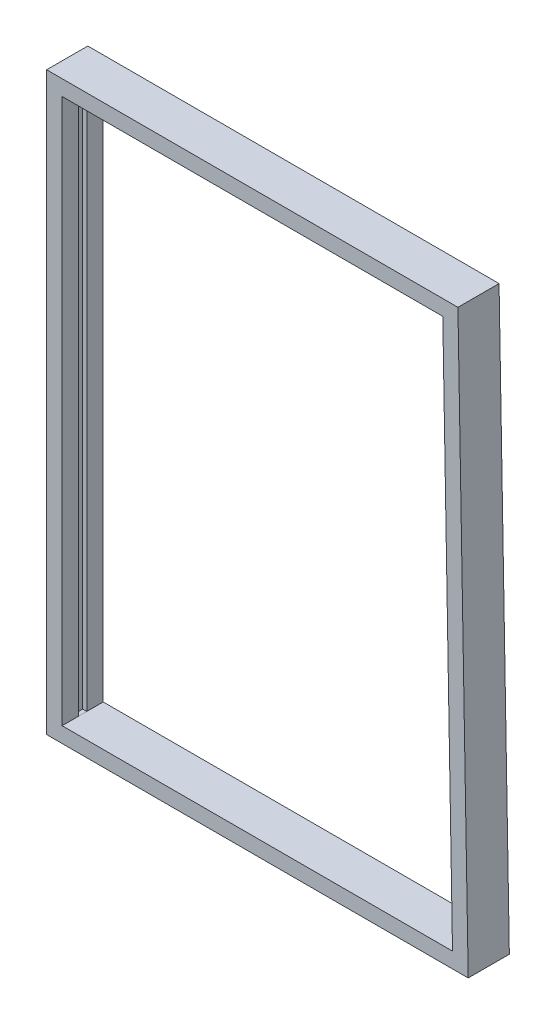
ISO-10303-21;
HEADER;
FILE_DESCRIPTION(('STEP AP214'),'2;1');
FILE_NAME('part.step','',(''),(''),'','','');
FILE_SCHEMA(('AUTOMOTIVE_DESIGN { 1 0 10303 214 1 1 1 1 }'));
ENDSEC;
DATA;
#1=APPLICATION_CONTEXT('core data for automotive mechanical design processes');
#2=APPLICATION_PROTOCOL_DEFINITION('international standard','automotive_design',2000,#1);
#3=PRODUCT_CONTEXT('',#1,'mechanical');
#4=PRODUCT('Part','Part','',(#3));
#5=PRODUCT_RELATED_PRODUCT_CATEGORY('part','',(#4));
#6=PRODUCT_DEFINITION_FORMATION('','',#4);
#7=PRODUCT_DEFINITION_CONTEXT('part definition',#1,'design');
#8=PRODUCT_DEFINITION('design','',#6,#7);
#9=PRODUCT_DEFINITION_SHAPE('','',#8);
#10=(LENGTH_UNIT() NAMED_UNIT(*) SI_UNIT(.MILLI.,.METRE.));
#11=(NAMED_UNIT(*) PLANE_ANGLE_UNIT() SI_UNIT($,.RADIAN.));
#12=(NAMED_UNIT(*) SI_UNIT($,.STERADIAN.) SOLID_ANGLE_UNIT());
#13=UNCERTAINTY_MEASURE_WITH_UNIT(LENGTH_MEASURE(1.E-05),#10,'distance_accuracy_value','');
#14=(GEOMETRIC_REPRESENTATION_CONTEXT(3) GLOBAL_UNCERTAINTY_ASSIGNED_CONTEXT((#13)) GLOBAL_UNIT_ASSIGNED_CONTEXT((#10,
#11,#12)) REPRESENTATION_CONTEXT('',''));
#15=CARTESIAN_POINT('',(0.,0.,0.));
#16=DIRECTION('',(0.,0.,1.));
#17=DIRECTION('',(1.,0.,0.));
#18=AXIS2_PLACEMENT_3D('',#15,#16,#17);
#19=CARTESIAN_POINT('',(-482.6,673.091493891155,101.6));
#20=DIRECTION('',(1.,0.,0.));
#21=DIRECTION('',(0.,0.,-1.));
#22=AXIS2_PLACEMENT_3D('',#19,#20,#21);
#23=PLANE('',#22);
#24=DIRECTION('',(0.,1.,0.));
#25=VECTOR('',#24,1.);
#26=CARTESIAN_POINT('',(-482.6,673.095746945578,40.64));
#27=LINE('',#26,#25);
#28=CARTESIAN_POINT('',(-482.6,-673.1,40.6399999999999));
#29=VERTEX_POINT('',#28);
#30=CARTESIAN_POINT('',(-482.6,673.091493891155,40.6399999999999));
#31=VERTEX_POINT('',#30);
#32=EDGE_CURVE('E53',#29,#31,#27,.T.);
#33=ORIENTED_EDGE('',*,*,#32,.F.);
#34=DIRECTION('',(0.,0.,-1.));
#35=VECTOR('',#34,1.);
#36=CARTESIAN_POINT('',(-482.6,-673.1,101.6));
#37=LINE('',#36,#35);
#38=CARTESIAN_POINT('',(-482.6,-673.1,0.));
#39=VERTEX_POINT('',#38);
#40=EDGE_CURVE('E296',#29,#39,#37,.T.);
#41=ORIENTED_EDGE('',*,*,#40,.T.);
#42=DIRECTION('',(0.,-1.,0.));
#43=VECTOR('',#42,1.);
#44=CARTESIAN_POINT('',(-482.6,673.091493891155,0.));
#45=LINE('',#44,#43);
#46=CARTESIAN_POINT('',(-482.6,673.091493891155,0.));
#47=VERTEX_POINT('',#46);
#48=EDGE_CURVE('E261',#47,#39,#45,.T.);
#49=ORIENTED_EDGE('',*,*,#48,.F.);
#50=DIRECTION('',(0.,0.,-1.));
#51=VECTOR('',#50,1.);
#52=CARTESIAN_POINT('',(-482.6,673.091493891155,101.6));
#53=LINE('',#52,#51);
#54=EDGE_CURVE('E272',#31,#47,#53,.T.);
#55=ORIENTED_EDGE('',*,*,#54,.F.);
#56=EDGE_LOOP('',(#33,#41,#49,#55));
#57=FACE_BOUND('',#56,.T.);
#58=ADVANCED_FACE('F38',(#57),#23,.T.);
#59=CARTESIAN_POINT('',(457.874215727726,672.881549449167,101.6));
#60=DIRECTION('',(-0.999840548194239,-0.0178571606545579,0.));
#61=DIRECTION('',(0.0178571606545579,-0.99984054819424,0.));
#62=AXIS2_PLACEMENT_3D('',#59,#60,#61);
#63=PLANE('',#62);
#64=DIRECTION('',(-0.0178571606545579,0.99984054819424,0.));
#65=VECTOR('',#64,1.);
#66=CARTESIAN_POINT('',(457.874181824698,672.883447714127,60.96));
#67=LINE('',#66,#65);
#68=CARTESIAN_POINT('',(481.913457594836,-673.1,60.9600000000001));
#69=VERTEX_POINT('',#68);
#70=CARTESIAN_POINT('',(457.874215727726,672.881549449167,60.9600000000001));
#71=VERTEX_POINT('',#70);
#72=EDGE_CURVE('E61',#69,#71,#67,.T.);
#73=ORIENTED_EDGE('',*,*,#72,.F.);
#74=DIRECTION('',(0.,0.,-1.));
#75=VECTOR('',#74,1.);
#76=CARTESIAN_POINT('',(481.913457594836,-673.1,101.6));
#77=LINE('',#76,#75);
#78=CARTESIAN_POINT('',(481.913457594836,-673.1,101.6));
#79=VERTEX_POINT('',#78);
#80=EDGE_CURVE('E293',#79,#69,#77,.T.);
#81=ORIENTED_EDGE('',*,*,#80,.F.);
#82=DIRECTION('',(-0.0178571606545579,0.999840548194239,0.));
#83=VECTOR('',#82,1.);
#84=CARTESIAN_POINT('',(457.874215727726,672.881549449167,101.6));
#85=LINE('',#84,#83);
#86=CARTESIAN_POINT('',(457.874215727726,672.881549449167,101.6));
#87=VERTEX_POINT('',#86);
#88=EDGE_CURVE('E267',#79,#87,#85,.T.);
#89=ORIENTED_EDGE('',*,*,#88,.T.);
#90=DIRECTION('',(0.,0.,-1.));
#91=VECTOR('',#90,1.);
#92=CARTESIAN_POINT('',(457.874215727726,672.881549449167,101.6));
#93=LINE('',#92,#91);
#94=EDGE_CURVE('E288',#87,#71,#93,.T.);
#95=ORIENTED_EDGE('',*,*,#94,.T.);
#96=EDGE_LOOP('',(#73,#81,#89,#95));
#97=FACE_BOUND('',#96,.T.);
#98=ADVANCED_FACE('F354',(#97),#63,.T.);
#99=CARTESIAN_POINT('',(0.,0.,101.6));
#100=DIRECTION('',(0.,0.,1.));
#101=DIRECTION('',(1.,0.,0.));
#102=AXIS2_PLACEMENT_3D('',#99,#100,#101);
#103=PLANE('',#102);
#104=DIRECTION('',(0.,-1.,0.));
#105=VECTOR('',#104,1.);
#106=CARTESIAN_POINT('',(-520.7,711.2,101.6));
#107=LINE('',#106,#105);
#108=CARTESIAN_POINT('',(-520.7,711.2,101.6));
#109=VERTEX_POINT('',#108);
#110=CARTESIAN_POINT('',(-520.7,-711.2,101.6));
#111=VERTEX_POINT('',#110);
#112=EDGE_CURVE('E301',#109,#111,#107,.T.);
#113=ORIENTED_EDGE('',*,*,#112,.T.);
#114=DIRECTION('',(1.,0.,0.));
#115=VECTOR('',#114,1.);
#116=CARTESIAN_POINT('',(-520.7,-711.2,101.6));
#117=LINE('',#116,#115);
#118=CARTESIAN_POINT('',(520.7,-711.2,101.6));
#119=VERTEX_POINT('',#118);
#120=EDGE_CURVE('E304',#111,#119,#117,.T.);
#121=ORIENTED_EDGE('',*,*,#120,.T.);
#122=DIRECTION('',(-0.0178571606545579,0.999840548194239,0.));
#123=VECTOR('',#122,1.);
#124=CARTESIAN_POINT('',(495.299974684957,710.973195751486,101.6));
#125=LINE('',#124,#123);
#126=CARTESIAN_POINT('',(495.299974684957,710.973195751486,101.6));
#127=VERTEX_POINT('',#126);
#128=EDGE_CURVE('E307',#119,#127,#125,.T.);
#129=ORIENTED_EDGE('',*,*,#128,.T.);
#130=DIRECTION('',(-0.999999975083619,0.000223232528064809,0.));
#131=VECTOR('',#130,1.);
#132=CARTESIAN_POINT('',(-520.7,711.2,101.6));
#133=LINE('',#132,#131);
#134=EDGE_CURVE('E309',#127,#109,#133,.T.);
#135=ORIENTED_EDGE('',*,*,#134,.T.);
#136=EDGE_LOOP('',(#113,#121,#129,#135));
#137=FACE_BOUND('',#136,.T.);
#138=DIRECTION('',(1.,0.,0.));
#139=VECTOR('',#138,1.);
#140=CARTESIAN_POINT('',(-482.6,-673.1,101.6));
#141=LINE('',#140,#139);
#142=CARTESIAN_POINT('',(-482.6,-673.1,101.6));
#143=VERTEX_POINT('',#142);
#144=EDGE_CURVE('E264',#143,#79,#141,.T.);
#145=ORIENTED_EDGE('',*,*,#144,.F.);
#146=DIRECTION('',(0.,-1.,0.));
#147=VECTOR('',#146,1.);
#148=CARTESIAN_POINT('',(-482.6,673.091493891155,101.6));
#149=LINE('',#148,#147);
#150=CARTESIAN_POINT('',(-482.6,673.091493891155,101.6));
#151=VERTEX_POINT('',#150);
#152=EDGE_CURVE('E262',#151,#143,#149,.T.);
#153=ORIENTED_EDGE('',*,*,#152,.F.);
#154=DIRECTION('',(-0.999999975083619,0.000223232528064827,0.));
#155=VECTOR('',#154,1.);
#156=CARTESIAN_POINT('',(-482.6,673.091493891155,101.6));
#157=LINE('',#156,#155);
#158=EDGE_CURVE('E270',#87,#151,#157,.T.);
#159=ORIENTED_EDGE('',*,*,#158,.F.);
#160=ORIENTED_EDGE('',*,*,#88,.F.);
#161=EDGE_LOOP('',(#145,#153,#159,#160));
#162=FACE_BOUND('',#161,.T.);
#163=ADVANCED_FACE('F344',(#137,#162),#103,.T.);
#164=CARTESIAN_POINT('',(0.,0.,0.));
#165=DIRECTION('',(0.,0.,1.));
#166=DIRECTION('',(1.,0.,0.));
#167=AXIS2_PLACEMENT_3D('',#164,#165,#166);
#168=PLANE('',#167);
#169=DIRECTION('',(0.,-1.,0.));
#170=VECTOR('',#169,1.);
#171=CARTESIAN_POINT('',(-520.7,711.2,0.));
#172=LINE('',#171,#170);
#173=CARTESIAN_POINT('',(-520.7,711.2,0.));
#174=VERTEX_POINT('',#173);
#175=CARTESIAN_POINT('',(-520.7,-711.2,0.));
#176=VERTEX_POINT('',#175);
#177=EDGE_CURVE('E300',#174,#176,#172,.T.);
#178=ORIENTED_EDGE('',*,*,#177,.F.);
#179=DIRECTION('',(-0.999999975083619,0.000223232528064809,0.));
#180=VECTOR('',#179,1.);
#181=CARTESIAN_POINT('',(-520.7,711.2,0.));
#182=LINE('',#181,#180);
#183=CARTESIAN_POINT('',(495.299974684957,710.973195751486,0.));
#184=VERTEX_POINT('',#183);
#185=EDGE_CURVE('E305',#184,#174,#182,.T.);
#186=ORIENTED_EDGE('',*,*,#185,.F.);
#187=DIRECTION('',(-0.0178571606545579,0.999840548194239,0.));
#188=VECTOR('',#187,1.);
#189=CARTESIAN_POINT('',(495.299974684957,710.973195751486,0.));
#190=LINE('',#189,#188);
#191=CARTESIAN_POINT('',(520.7,-711.2,0.));
#192=VERTEX_POINT('',#191);
#193=EDGE_CURVE('E316',#192,#184,#190,.T.);
#194=ORIENTED_EDGE('',*,*,#193,.F.);
#195=DIRECTION('',(1.,0.,0.));
#196=VECTOR('',#195,1.);
#197=CARTESIAN_POINT('',(-520.7,-711.2,0.));
#198=LINE('',#197,#196);
#199=EDGE_CURVE('E314',#176,#192,#198,.T.);
#200=ORIENTED_EDGE('',*,*,#199,.F.);
#201=EDGE_LOOP('',(#178,#186,#194,#200));
#202=FACE_BOUND('',#201,.T.);
#203=ORIENTED_EDGE('',*,*,#48,.T.);
#204=DIRECTION('',(1.,0.,0.));
#205=VECTOR('',#204,1.);
#206=CARTESIAN_POINT('',(-482.6,-673.1,0.));
#207=LINE('',#206,#205);
#208=CARTESIAN_POINT('',(481.913457594836,-673.1,0.));
#209=VERTEX_POINT('',#208);
#210=EDGE_CURVE('E275',#39,#209,#207,.T.);
#211=ORIENTED_EDGE('',*,*,#210,.T.);
#212=DIRECTION('',(-0.0178571606545579,0.999840548194239,0.));
#213=VECTOR('',#212,1.);
#214=CARTESIAN_POINT('',(457.874215727726,672.881549449167,0.));
#215=LINE('',#214,#213);
#216=CARTESIAN_POINT('',(457.874215727726,672.881549449167,0.));
#217=VERTEX_POINT('',#216);
#218=EDGE_CURVE('E278',#209,#217,#215,.T.);
#219=ORIENTED_EDGE('',*,*,#218,.T.);
#220=DIRECTION('',(-0.999999975083619,0.000223232528064827,0.));
#221=VECTOR('',#220,1.);
#222=CARTESIAN_POINT('',(-482.6,673.091493891155,0.));
#223=LINE('',#222,#221);
#224=EDGE_CURVE('E265',#217,#47,#223,.T.);
#225=ORIENTED_EDGE('',*,*,#224,.T.);
#226=EDGE_LOOP('',(#203,#211,#219,#225));
#227=FACE_BOUND('',#226,.T.);
#228=ADVANCED_FACE('F334',(#202,#227),#168,.F.);
#229=CARTESIAN_POINT('',(-520.7,711.2,101.6));
#230=DIRECTION('',(1.,0.,0.));
#231=DIRECTION('',(0.,0.,-1.));
#232=AXIS2_PLACEMENT_3D('',#229,#230,#231);
#233=PLANE('',#232);
#234=ORIENTED_EDGE('',*,*,#177,.T.);
#235=DIRECTION('',(0.,0.,-1.));
#236=VECTOR('',#235,1.);
#237=CARTESIAN_POINT('',(-520.7,-711.2,101.6));
#238=LINE('',#237,#236);
#239=EDGE_CURVE('E11',#111,#176,#238,.T.);
#240=ORIENTED_EDGE('',*,*,#239,.F.);
#241=ORIENTED_EDGE('',*,*,#112,.F.);
#242=DIRECTION('',(0.,0.,-1.));
#243=VECTOR('',#242,1.);
#244=CARTESIAN_POINT('',(-520.7,711.2,101.6));
#245=LINE('',#244,#243);
#246=EDGE_CURVE('E311',#109,#174,#245,.T.);
#247=ORIENTED_EDGE('',*,*,#246,.T.);
#248=EDGE_LOOP('',(#234,#240,#241,#247));
#249=FACE_BOUND('',#248,.T.);
#250=ADVANCED_FACE('F40',(#249),#233,.F.);
#251=CARTESIAN_POINT('',(-520.7,-711.2,101.6));
#252=DIRECTION('',(0.,1.,0.));
#253=DIRECTION('',(0.,0.,1.));
#254=AXIS2_PLACEMENT_3D('',#251,#252,#253);
#255=PLANE('',#254);
#256=ORIENTED_EDGE('',*,*,#199,.T.);
#257=DIRECTION('',(0.,0.,-1.));
#258=VECTOR('',#257,1.);
#259=CARTESIAN_POINT('',(520.7,-711.2,101.6));
#260=LINE('',#259,#258);
#261=EDGE_CURVE('E46',#119,#192,#260,.T.);
#262=ORIENTED_EDGE('',*,*,#261,.F.);
#263=ORIENTED_EDGE('',*,*,#120,.F.);
#264=ORIENTED_EDGE('',*,*,#239,.T.);
#265=EDGE_LOOP('',(#256,#262,#263,#264));
#266=FACE_BOUND('',#265,.T.);
#267=ADVANCED_FACE('F346',(#266),#255,.F.);
#268=CARTESIAN_POINT('',(495.299974684957,710.973195751486,101.6));
#269=DIRECTION('',(-0.999840548194239,-0.0178571606545579,0.));
#270=DIRECTION('',(0.0178571606545579,-0.99984054819424,0.));
#271=AXIS2_PLACEMENT_3D('',#268,#269,#270);
#272=PLANE('',#271);
#273=ORIENTED_EDGE('',*,*,#193,.T.);
#274=DIRECTION('',(0.,0.,-1.));
#275=VECTOR('',#274,1.);
#276=CARTESIAN_POINT('',(495.299974684957,710.973195751486,101.6));
#277=LINE('',#276,#275);
#278=EDGE_CURVE('E321',#127,#184,#277,.T.);
#279=ORIENTED_EDGE('',*,*,#278,.F.);
#280=ORIENTED_EDGE('',*,*,#128,.F.);
#281=ORIENTED_EDGE('',*,*,#261,.T.);
#282=EDGE_LOOP('',(#273,#279,#280,#281));
#283=FACE_BOUND('',#282,.T.);
#284=ADVANCED_FACE('F328',(#283),#272,.F.);
#285=CARTESIAN_POINT('',(-520.7,711.2,101.6));
#286=DIRECTION('',(-0.000223232528064809,-0.999999975083619,0.));
#287=DIRECTION('',(0.999999975083619,-0.000223232528064809,0.));
#288=AXIS2_PLACEMENT_3D('',#285,#286,#287);
#289=PLANE('',#288);
#290=ORIENTED_EDGE('',*,*,#185,.T.);
#291=ORIENTED_EDGE('',*,*,#246,.F.);
#292=ORIENTED_EDGE('',*,*,#134,.F.);
#293=ORIENTED_EDGE('',*,*,#278,.T.);
#294=EDGE_LOOP('',(#290,#291,#292,#293));
#295=FACE_BOUND('',#294,.T.);
#296=ADVANCED_FACE('F338',(#295),#289,.F.);
#297=DIRECTION('',(0.,-1.,0.));
#298=VECTOR('',#297,1.);
#299=CARTESIAN_POINT('',(-482.6,673.095746945578,60.9600000000001));
#300=LINE('',#299,#298);
#301=CARTESIAN_POINT('',(-482.6,673.091493891155,60.9600000000001));
#302=VERTEX_POINT('',#301);
#303=CARTESIAN_POINT('',(-482.6,-673.1,60.9599999999999));
#304=VERTEX_POINT('',#303);
#305=EDGE_CURVE('E213',#302,#304,#300,.T.);
#306=ORIENTED_EDGE('',*,*,#305,.F.);
#307=EDGE_CURVE('E283',#151,#302,#53,.T.);
#308=ORIENTED_EDGE('',*,*,#307,.F.);
#309=ORIENTED_EDGE('',*,*,#152,.T.);
#310=EDGE_CURVE('E297',#143,#304,#37,.T.);
#311=ORIENTED_EDGE('',*,*,#310,.T.);
#312=EDGE_LOOP('',(#306,#308,#309,#311));
#313=FACE_BOUND('',#312,.T.);
#314=ADVANCED_FACE('F357',(#313),#23,.T.);
#315=CARTESIAN_POINT('',(-482.6,-673.1,101.6));
#316=DIRECTION('',(0.,1.,0.));
#317=DIRECTION('',(0.,0.,1.));
#318=AXIS2_PLACEMENT_3D('',#315,#316,#317);
#319=PLANE('',#318);
#320=ORIENTED_EDGE('',*,*,#210,.F.);
#321=ORIENTED_EDGE('',*,*,#40,.F.);
#322=DIRECTION('',(0.,0.,-1.));
#323=VECTOR('',#322,1.);
#324=CARTESIAN_POINT('',(-482.6,-673.1,101.6));
#325=LINE('',#324,#323);
#326=EDGE_CURVE('E217',#304,#29,#325,.T.);
#327=ORIENTED_EDGE('',*,*,#326,.F.);
#328=ORIENTED_EDGE('',*,*,#310,.F.);
#329=ORIENTED_EDGE('',*,*,#144,.T.);
#330=ORIENTED_EDGE('',*,*,#80,.T.);
#331=DIRECTION('',(0.,0.,1.));
#332=VECTOR('',#331,1.);
#333=CARTESIAN_POINT('',(481.913457594836,-673.1,101.6));
#334=LINE('',#333,#332);
#335=CARTESIAN_POINT('',(481.913457594836,-673.1,40.6400000000001));
#336=VERTEX_POINT('',#335);
#337=EDGE_CURVE('E252',#336,#69,#334,.T.);
#338=ORIENTED_EDGE('',*,*,#337,.F.);
#339=EDGE_CURVE('E291',#336,#209,#77,.T.);
#340=ORIENTED_EDGE('',*,*,#339,.T.);
#341=EDGE_LOOP('',(#320,#321,#327,#328,#329,#330,#338,#340));
#342=FACE_BOUND('',#341,.T.);
#343=ADVANCED_FACE('F368',(#342),#319,.T.);
#344=DIRECTION('',(0.0178571606545579,-0.99984054819424,0.));
#345=VECTOR('',#344,1.);
#346=CARTESIAN_POINT('',(457.874181824698,672.883447714127,40.64));
#347=LINE('',#346,#345);
#348=CARTESIAN_POINT('',(457.874215727726,672.881549449167,40.64));
#349=VERTEX_POINT('',#348);
#350=EDGE_CURVE('E247',#349,#336,#347,.T.);
#351=ORIENTED_EDGE('',*,*,#350,.F.);
#352=EDGE_CURVE('E286',#349,#217,#93,.T.);
#353=ORIENTED_EDGE('',*,*,#352,.T.);
#354=ORIENTED_EDGE('',*,*,#218,.F.);
#355=ORIENTED_EDGE('',*,*,#339,.F.);
#356=EDGE_LOOP('',(#351,#353,#354,#355));
#357=FACE_BOUND('',#356,.T.);
#358=ADVANCED_FACE('F365',(#357),#63,.T.);
#359=CARTESIAN_POINT('',(-482.6,673.091493891155,101.6));
#360=DIRECTION('',(-0.000223232528064827,-0.999999975083619,0.));
#361=DIRECTION('',(0.999999975083619,-0.000223232528064827,0.));
#362=AXIS2_PLACEMENT_3D('',#359,#360,#361);
#363=PLANE('',#362);
#364=ORIENTED_EDGE('',*,*,#224,.F.);
#365=ORIENTED_EDGE('',*,*,#352,.F.);
#366=EDGE_CURVE('E292',#71,#349,#93,.T.);
#367=ORIENTED_EDGE('',*,*,#366,.F.);
#368=ORIENTED_EDGE('',*,*,#94,.F.);
#369=ORIENTED_EDGE('',*,*,#158,.T.);
#370=ORIENTED_EDGE('',*,*,#307,.T.);
#371=EDGE_CURVE('E287',#302,#31,#53,.T.);
#372=ORIENTED_EDGE('',*,*,#371,.T.);
#373=ORIENTED_EDGE('',*,*,#54,.T.);
#374=EDGE_LOOP('',(#364,#365,#367,#368,#369,#370,#372,#373));
#375=FACE_BOUND('',#374,.T.);
#376=ADVANCED_FACE('F386',(#375),#363,.T.);
#377=CARTESIAN_POINT('',(469.742047624445,8.38959694701351,0.));
#378=DIRECTION('',(-0.99984054819424,-0.0178571606545579,0.));
#379=DIRECTION('',(0.0178571606545579,-0.99984054819424,0.));
#380=AXIS2_PLACEMENT_3D('',#377,#378,#379);
#381=PLANE('',#380);
#382=ORIENTED_EDGE('',*,*,#337,.T.);
#383=CARTESIAN_POINT('',(481.913491497864,-673.101898264958,60.9600000000001));
#384=VERTEX_POINT('',#383);
#385=EDGE_CURVE('E238',#384,#69,#67,.T.);
#386=ORIENTED_EDGE('',*,*,#385,.F.);
#387=DIRECTION('',(0.,0.,1.));
#388=VECTOR('',#387,1.);
#389=CARTESIAN_POINT('',(481.913491497864,-673.101898264958,40.6400000000001));
#390=LINE('',#389,#388);
#391=CARTESIAN_POINT('',(481.913491497864,-673.101898264958,40.6400000000001));
#392=VERTEX_POINT('',#391);
#393=EDGE_CURVE('E228',#392,#384,#390,.T.);
#394=ORIENTED_EDGE('',*,*,#393,.F.);
#395=EDGE_CURVE('E243',#336,#392,#347,.T.);
#396=ORIENTED_EDGE('',*,*,#395,.F.);
#397=EDGE_LOOP('',(#382,#386,#394,#396));
#398=FACE_BOUND('',#397,.T.);
#399=ADVANCED_FACE('F427',(#398),#381,.F.);
#400=CARTESIAN_POINT('',(468.032561794352,673.064876466378,60.96));
#401=DIRECTION('',(0.,0.,1.));
#402=DIRECTION('',(0.,-1.,0.));
#403=AXIS2_PLACEMENT_3D('',#400,#401,#402);
#404=PLANE('',#403);
#405=ORIENTED_EDGE('',*,*,#385,.T.);
#406=ORIENTED_EDGE('',*,*,#72,.T.);
#407=CARTESIAN_POINT('',(457.874181824698,672.883447714127,60.96));
#408=VERTEX_POINT('',#407);
#409=EDGE_CURVE('E223',#71,#408,#67,.T.);
#410=ORIENTED_EDGE('',*,*,#409,.T.);
#411=DIRECTION('',(-0.99984054819424,-0.0178571606545579,0.));
#412=VECTOR('',#411,1.);
#413=CARTESIAN_POINT('',(468.032561794352,673.064876466378,60.96));
#414=LINE('',#413,#412);
#415=CARTESIAN_POINT('',(468.032561794352,673.064876466378,60.96));
#416=VERTEX_POINT('',#415);
#417=EDGE_CURVE('E237',#416,#408,#414,.T.);
#418=ORIENTED_EDGE('',*,*,#417,.F.);
#419=DIRECTION('',(-0.0178571606545579,0.99984054819424,0.));
#420=VECTOR('',#419,1.);
#421=CARTESIAN_POINT('',(468.032561794352,673.064876466378,60.96));
#422=LINE('',#421,#420);
#423=CARTESIAN_POINT('',(492.071871467517,-672.920469512708,60.9600000000001));
#424=VERTEX_POINT('',#423);
#425=EDGE_CURVE('E224',#424,#416,#422,.T.);
#426=ORIENTED_EDGE('',*,*,#425,.F.);
#427=DIRECTION('',(-0.99984054819424,-0.0178571606545579,0.));
#428=VECTOR('',#427,1.);
#429=CARTESIAN_POINT('',(492.071871467517,-672.920469512708,60.9600000000001));
#430=LINE('',#429,#428);
#431=EDGE_CURVE('E250',#424,#384,#430,.T.);
#432=ORIENTED_EDGE('',*,*,#431,.T.);
#433=EDGE_LOOP('',(#405,#406,#410,#418,#426,#432));
#434=FACE_BOUND('',#433,.T.);
#435=ADVANCED_FACE('F418',(#434),#404,.F.);
#436=CARTESIAN_POINT('',(492.071871467517,-672.920469512708,40.6400000000001));
#437=DIRECTION('',(0.0178571606545579,-0.99984054819424,0.));
#438=DIRECTION('',(0.99984054819424,0.0178571606545579,0.));
#439=AXIS2_PLACEMENT_3D('',#436,#437,#438);
#440=PLANE('',#439);
#441=ORIENTED_EDGE('',*,*,#393,.T.);
#442=ORIENTED_EDGE('',*,*,#431,.F.);
#443=DIRECTION('',(0.,0.,1.));
#444=VECTOR('',#443,1.);
#445=CARTESIAN_POINT('',(492.071871467517,-672.920469512708,40.6400000000001));
#446=LINE('',#445,#444);
#447=CARTESIAN_POINT('',(492.071871467517,-672.920469512708,40.6400000000001));
#448=VERTEX_POINT('',#447);
#449=EDGE_CURVE('E234',#448,#424,#446,.T.);
#450=ORIENTED_EDGE('',*,*,#449,.F.);
#451=DIRECTION('',(-0.99984054819424,-0.0178571606545579,0.));
#452=VECTOR('',#451,1.);
#453=CARTESIAN_POINT('',(492.071871467517,-672.920469512708,40.6400000000001));
#454=LINE('',#453,#452);
#455=EDGE_CURVE('E253',#448,#392,#454,.T.);
#456=ORIENTED_EDGE('',*,*,#455,.T.);
#457=EDGE_LOOP('',(#441,#442,#450,#456));
#458=FACE_BOUND('',#457,.T.);
#459=ADVANCED_FACE('F424',(#458),#440,.F.);
#460=CARTESIAN_POINT('',(468.032561794352,673.064876466378,40.64));
#461=DIRECTION('',(0.,0.,-1.));
#462=DIRECTION('',(0.,1.,0.));
#463=AXIS2_PLACEMENT_3D('',#460,#461,#462);
#464=PLANE('',#463);
#465=CARTESIAN_POINT('',(457.874181824698,672.883447714127,40.64));
#466=VERTEX_POINT('',#465);
#467=EDGE_CURVE('E244',#466,#349,#347,.T.);
#468=ORIENTED_EDGE('',*,*,#467,.T.);
#469=ORIENTED_EDGE('',*,*,#350,.T.);
#470=ORIENTED_EDGE('',*,*,#395,.T.);
#471=ORIENTED_EDGE('',*,*,#455,.F.);
#472=DIRECTION('',(0.0178571606545579,-0.99984054819424,0.));
#473=VECTOR('',#472,1.);
#474=CARTESIAN_POINT('',(468.032561794352,673.064876466378,40.64));
#475=LINE('',#474,#473);
#476=CARTESIAN_POINT('',(468.032561794352,673.064876466378,40.64));
#477=VERTEX_POINT('',#476);
#478=EDGE_CURVE('E231',#477,#448,#475,.T.);
#479=ORIENTED_EDGE('',*,*,#478,.F.);
#480=DIRECTION('',(-0.99984054819424,-0.0178571606545579,0.));
#481=VECTOR('',#480,1.);
#482=CARTESIAN_POINT('',(468.032561794352,673.064876466378,40.64));
#483=LINE('',#482,#481);
#484=EDGE_CURVE('E256',#477,#466,#483,.T.);
#485=ORIENTED_EDGE('',*,*,#484,.T.);
#486=EDGE_LOOP('',(#468,#469,#470,#471,#479,#485));
#487=FACE_BOUND('',#486,.T.);
#488=ADVANCED_FACE('F412',(#487),#464,.F.);
#489=CARTESIAN_POINT('',(468.032561794352,673.064876466378,40.64));
#490=DIRECTION('',(-0.0178571606545579,0.99984054819424,0.));
#491=DIRECTION('',(-0.99984054819424,-0.0178571606545579,0.));
#492=AXIS2_PLACEMENT_3D('',#489,#490,#491);
#493=PLANE('',#492);
#494=DIRECTION('',(0.,0.,-1.));
#495=VECTOR('',#494,1.);
#496=CARTESIAN_POINT('',(457.874181824698,672.883447714127,40.64));
#497=LINE('',#496,#495);
#498=EDGE_CURVE('E240',#408,#466,#497,.T.);
#499=ORIENTED_EDGE('',*,*,#498,.T.);
#500=ORIENTED_EDGE('',*,*,#484,.F.);
#501=DIRECTION('',(0.,0.,-1.));
#502=VECTOR('',#501,1.);
#503=CARTESIAN_POINT('',(468.032561794352,673.064876466378,40.64));
#504=LINE('',#503,#502);
#505=EDGE_CURVE('E227',#416,#477,#504,.T.);
#506=ORIENTED_EDGE('',*,*,#505,.F.);
#507=ORIENTED_EDGE('',*,*,#417,.T.);
#508=EDGE_LOOP('',(#499,#500,#506,#507));
#509=FACE_BOUND('',#508,.T.);
#510=ADVANCED_FACE('F416',(#509),#493,.F.);
#511=CARTESIAN_POINT('',(479.900427594098,8.57102569926381,0.));
#512=DIRECTION('',(-0.99984054819424,-0.0178571606545579,0.));
#513=DIRECTION('',(0.0178571606545579,-0.99984054819424,0.));
#514=AXIS2_PLACEMENT_3D('',#511,#512,#513);
#515=PLANE('',#514);
#516=ORIENTED_EDGE('',*,*,#425,.T.);
#517=ORIENTED_EDGE('',*,*,#505,.T.);
#518=ORIENTED_EDGE('',*,*,#478,.T.);
#519=ORIENTED_EDGE('',*,*,#449,.T.);
#520=EDGE_LOOP('',(#516,#517,#518,#519));
#521=FACE_BOUND('',#520,.T.);
#522=ADVANCED_FACE('F422',(#521),#515,.T.);
#523=ORIENTED_EDGE('',*,*,#366,.T.);
#524=ORIENTED_EDGE('',*,*,#467,.F.);
#525=ORIENTED_EDGE('',*,*,#498,.F.);
#526=ORIENTED_EDGE('',*,*,#409,.F.);
#527=EDGE_LOOP('',(#523,#524,#525,#526));
#528=FACE_BOUND('',#527,.T.);
#529=ADVANCED_FACE('F409',(#528),#381,.F.);
#530=CARTESIAN_POINT('',(-482.6,0.,0.));
#531=DIRECTION('',(1.,0.,0.));
#532=DIRECTION('',(0.,0.,-1.));
#533=AXIS2_PLACEMENT_3D('',#530,#531,#532);
#534=PLANE('',#533);
#535=ORIENTED_EDGE('',*,*,#326,.T.);
#536=CARTESIAN_POINT('',(-482.6,-673.104253054422,40.6399999999999));
#537=VERTEX_POINT('',#536);
#538=EDGE_CURVE('E207',#537,#29,#27,.T.);
#539=ORIENTED_EDGE('',*,*,#538,.F.);
#540=DIRECTION('',(0.,0.,-1.));
#541=VECTOR('',#540,1.);
#542=CARTESIAN_POINT('',(-482.6,-673.104253054422,60.9599999999999));
#543=LINE('',#542,#541);
#544=CARTESIAN_POINT('',(-482.6,-673.104253054422,60.9599999999999));
#545=VERTEX_POINT('',#544);
#546=EDGE_CURVE('E199',#545,#537,#543,.T.);
#547=ORIENTED_EDGE('',*,*,#546,.F.);
#548=EDGE_CURVE('E211',#304,#545,#300,.T.);
#549=ORIENTED_EDGE('',*,*,#548,.F.);
#550=EDGE_LOOP('',(#535,#539,#547,#549));
#551=FACE_BOUND('',#550,.T.);
#552=ADVANCED_FACE('F396',(#551),#534,.F.);
#553=CARTESIAN_POINT('',(-492.76,673.095746945578,40.64));
#554=DIRECTION('',(0.,0.,-1.));
#555=DIRECTION('',(0.,1.,0.));
#556=AXIS2_PLACEMENT_3D('',#553,#554,#555);
#557=PLANE('',#556);
#558=ORIENTED_EDGE('',*,*,#538,.T.);
#559=ORIENTED_EDGE('',*,*,#32,.T.);
#560=CARTESIAN_POINT('',(-482.6,673.095746945578,40.64));
#561=VERTEX_POINT('',#560);
#562=EDGE_CURVE('E182',#31,#561,#27,.T.);
#563=ORIENTED_EDGE('',*,*,#562,.T.);
#564=DIRECTION('',(1.,0.,0.));
#565=VECTOR('',#564,1.);
#566=CARTESIAN_POINT('',(-492.76,673.095746945578,40.64));
#567=LINE('',#566,#565);
#568=CARTESIAN_POINT('',(-492.76,673.095746945578,40.64));
#569=VERTEX_POINT('',#568);
#570=EDGE_CURVE('E176',#569,#561,#567,.T.);
#571=ORIENTED_EDGE('',*,*,#570,.F.);
#572=DIRECTION('',(0.,1.,0.));
#573=VECTOR('',#572,1.);
#574=CARTESIAN_POINT('',(-492.76,673.095746945578,40.64));
#575=LINE('',#574,#573);
#576=CARTESIAN_POINT('',(-492.76,-673.104253054422,40.6399999999999));
#577=VERTEX_POINT('',#576);
#578=EDGE_CURVE('E180',#577,#569,#575,.T.);
#579=ORIENTED_EDGE('',*,*,#578,.F.);
#580=DIRECTION('',(1.,0.,0.));
#581=VECTOR('',#580,1.);
#582=CARTESIAN_POINT('',(-492.76,-673.104253054422,40.6399999999999));
#583=LINE('',#582,#581);
#584=EDGE_CURVE('E215',#577,#537,#583,.T.);
#585=ORIENTED_EDGE('',*,*,#584,.T.);
#586=EDGE_LOOP('',(#558,#559,#563,#571,#579,#585));
#587=FACE_BOUND('',#586,.T.);
#588=ADVANCED_FACE('F178',(#587),#557,.F.);
#589=CARTESIAN_POINT('',(-492.76,-673.104253054422,60.9599999999999));
#590=DIRECTION('',(0.,-1.,0.));
#591=DIRECTION('',(0.,0.,-1.));
#592=AXIS2_PLACEMENT_3D('',#589,#590,#591);
#593=PLANE('',#592);
#594=ORIENTED_EDGE('',*,*,#546,.T.);
#595=ORIENTED_EDGE('',*,*,#584,.F.);
#596=DIRECTION('',(0.,0.,-1.));
#597=VECTOR('',#596,1.);
#598=CARTESIAN_POINT('',(-492.76,-673.104253054422,60.9599999999999));
#599=LINE('',#598,#597);
#600=CARTESIAN_POINT('',(-492.76,-673.104253054422,60.9599999999999));
#601=VERTEX_POINT('',#600);
#602=EDGE_CURVE('E187',#601,#577,#599,.T.);
#603=ORIENTED_EDGE('',*,*,#602,.F.);
#604=DIRECTION('',(1.,0.,0.));
#605=VECTOR('',#604,1.);
#606=CARTESIAN_POINT('',(-492.76,-673.104253054422,60.9599999999999));
#607=LINE('',#606,#605);
#608=EDGE_CURVE('E218',#601,#545,#607,.T.);
#609=ORIENTED_EDGE('',*,*,#608,.T.);
#610=EDGE_LOOP('',(#594,#595,#603,#609));
#611=FACE_BOUND('',#610,.T.);
#612=ADVANCED_FACE('F452',(#611),#593,.F.);
#613=CARTESIAN_POINT('',(-492.76,673.095746945578,60.9600000000001));
#614=DIRECTION('',(0.,0.,1.));
#615=DIRECTION('',(0.,-1.,0.));
#616=AXIS2_PLACEMENT_3D('',#613,#614,#615);
#617=PLANE('',#616);
#618=CARTESIAN_POINT('',(-482.6,673.095746945578,60.9600000000001));
#619=VERTEX_POINT('',#618);
#620=EDGE_CURVE('E202',#619,#302,#300,.T.);
#621=ORIENTED_EDGE('',*,*,#620,.T.);
#622=ORIENTED_EDGE('',*,*,#305,.T.);
#623=ORIENTED_EDGE('',*,*,#548,.T.);
#624=ORIENTED_EDGE('',*,*,#608,.F.);
#625=DIRECTION('',(0.,-1.,0.));
#626=VECTOR('',#625,1.);
#627=CARTESIAN_POINT('',(-492.76,673.095746945578,60.9600000000001));
#628=LINE('',#627,#626);
#629=CARTESIAN_POINT('',(-492.76,673.095746945578,60.9600000000001));
#630=VERTEX_POINT('',#629);
#631=EDGE_CURVE('E195',#630,#601,#628,.T.);
#632=ORIENTED_EDGE('',*,*,#631,.F.);
#633=DIRECTION('',(1.,0.,0.));
#634=VECTOR('',#633,1.);
#635=CARTESIAN_POINT('',(-492.76,673.095746945578,60.9600000000001));
#636=LINE('',#635,#634);
#637=EDGE_CURVE('E186',#630,#619,#636,.T.);
#638=ORIENTED_EDGE('',*,*,#637,.T.);
#639=EDGE_LOOP('',(#621,#622,#623,#624,#632,#638));
#640=FACE_BOUND('',#639,.T.);
#641=ADVANCED_FACE('F455',(#640),#617,.F.);
#642=CARTESIAN_POINT('',(-492.76,673.095746945578,60.9600000000001));
#643=DIRECTION('',(0.,1.,0.));
#644=DIRECTION('',(0.,0.,1.));
#645=AXIS2_PLACEMENT_3D('',#642,#643,#644);
#646=PLANE('',#645);
#647=DIRECTION('',(0.,0.,1.));
#648=VECTOR('',#647,1.);
#649=CARTESIAN_POINT('',(-482.6,673.095746945578,60.9600000000001));
#650=LINE('',#649,#648);
#651=EDGE_CURVE('E209',#561,#619,#650,.T.);
#652=ORIENTED_EDGE('',*,*,#651,.T.);
#653=ORIENTED_EDGE('',*,*,#637,.F.);
#654=DIRECTION('',(0.,0.,1.));
#655=VECTOR('',#654,1.);
#656=CARTESIAN_POINT('',(-492.76,673.095746945578,60.9600000000001));
#657=LINE('',#656,#655);
#658=EDGE_CURVE('E190',#569,#630,#657,.T.);
#659=ORIENTED_EDGE('',*,*,#658,.F.);
#660=ORIENTED_EDGE('',*,*,#570,.T.);
#661=EDGE_LOOP('',(#652,#653,#659,#660));
#662=FACE_BOUND('',#661,.T.);
#663=ADVANCED_FACE('F191',(#662),#646,.F.);
#664=CARTESIAN_POINT('',(-492.76,0.,0.));
#665=DIRECTION('',(1.,0.,0.));
#666=DIRECTION('',(0.,0.,-1.));
#667=AXIS2_PLACEMENT_3D('',#664,#665,#666);
#668=PLANE('',#667);
#669=ORIENTED_EDGE('',*,*,#578,.T.);
#670=ORIENTED_EDGE('',*,*,#658,.T.);
#671=ORIENTED_EDGE('',*,*,#631,.T.);
#672=ORIENTED_EDGE('',*,*,#602,.T.);
#673=EDGE_LOOP('',(#669,#670,#671,#672));
#674=FACE_BOUND('',#673,.T.);
#675=ADVANCED_FACE('F197',(#674),#668,.T.);
#676=ORIENTED_EDGE('',*,*,#371,.F.);
#677=ORIENTED_EDGE('',*,*,#620,.F.);
#678=ORIENTED_EDGE('',*,*,#651,.F.);
#679=ORIENTED_EDGE('',*,*,#562,.F.);
#680=EDGE_LOOP('',(#676,#677,#678,#679));
#681=FACE_BOUND('',#680,.T.);
#682=ADVANCED_FACE('F444',(#681),#534,.F.);
#683=CLOSED_SHELL('',(#58,#98,#163,#228,#250,#267,#284,#296,#314,#343,#358,#376,#399,#435,#459,
#488,#510,#522,#529,#552,#588,#612,#641,#663,#675,#682));
#684=MANIFOLD_SOLID_BREP('B2',#683);
#685=ADVANCED_BREP_SHAPE_REPRESENTATION('',(#18,#684),#14);
#686=SHAPE_DEFINITION_REPRESENTATION(#9,#685);
ENDSEC;
END-ISO-10303-21;
